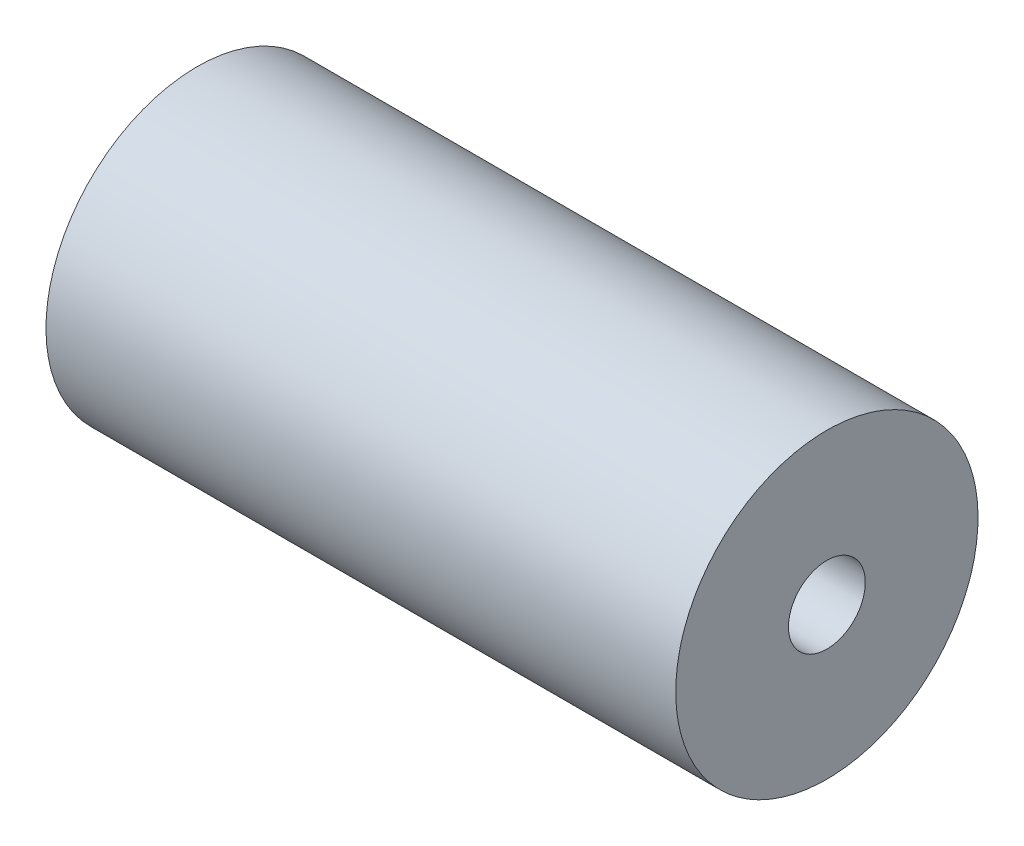
ISO-10303-21;
HEADER;
FILE_DESCRIPTION(('STEP AP214'),'2;1');
FILE_NAME('part.step','',(''),(''),'','','');
FILE_SCHEMA(('AUTOMOTIVE_DESIGN { 1 0 10303 214 1 1 1 1 }'));
ENDSEC;
DATA;
#1=APPLICATION_CONTEXT('core data for automotive mechanical design processes');
#2=APPLICATION_PROTOCOL_DEFINITION('international standard','automotive_design',2000,#1);
#3=PRODUCT_CONTEXT('',#1,'mechanical');
#4=PRODUCT('Part','Part','',(#3));
#5=PRODUCT_RELATED_PRODUCT_CATEGORY('part','',(#4));
#6=PRODUCT_DEFINITION_FORMATION('','',#4);
#7=PRODUCT_DEFINITION_CONTEXT('part definition',#1,'design');
#8=PRODUCT_DEFINITION('design','',#6,#7);
#9=PRODUCT_DEFINITION_SHAPE('','',#8);
#10=(LENGTH_UNIT() NAMED_UNIT(*) SI_UNIT(.MILLI.,.METRE.));
#11=(NAMED_UNIT(*) PLANE_ANGLE_UNIT() SI_UNIT($,.RADIAN.));
#12=(NAMED_UNIT(*) SI_UNIT($,.STERADIAN.) SOLID_ANGLE_UNIT());
#13=UNCERTAINTY_MEASURE_WITH_UNIT(LENGTH_MEASURE(1.E-05),#10,'distance_accuracy_value','');
#14=(GEOMETRIC_REPRESENTATION_CONTEXT(3) GLOBAL_UNCERTAINTY_ASSIGNED_CONTEXT((#13)) GLOBAL_UNIT_ASSIGNED_CONTEXT((#10,
#11,#12)) REPRESENTATION_CONTEXT('',''));
#15=CARTESIAN_POINT('',(0.,0.,0.));
#16=DIRECTION('',(0.,0.,1.));
#17=DIRECTION('',(1.,0.,0.));
#18=AXIS2_PLACEMENT_3D('',#15,#16,#17);
#19=CARTESIAN_POINT('',(19.85,0.,0.));
#20=DIRECTION('',(1.,0.,0.));
#21=DIRECTION('',(0.,0.,-1.));
#22=AXIS2_PLACEMENT_3D('',#19,#20,#21);
#23=PLANE('',#22);
#24=CARTESIAN_POINT('',(19.85,37.,-20.));
#25=DIRECTION('',(1.,0.,0.));
#26=DIRECTION('',(0.,0.,-1.));
#27=AXIS2_PLACEMENT_3D('',#24,#25,#26);
#28=CIRCLE('',#27,3.05);
#29=CARTESIAN_POINT('',(19.85,37.,-16.95));
#30=VERTEX_POINT('',#29);
#31=EDGE_CURVE('E50',#30,#30,#28,.T.);
#32=ORIENTED_EDGE('',*,*,#31,.T.);
#33=EDGE_LOOP('',(#32));
#34=FACE_BOUND('',#33,.T.);
#35=CARTESIAN_POINT('',(19.85,37.,-20.));
#36=DIRECTION('',(1.,0.,0.));
#37=DIRECTION('',(0.,0.,-1.));
#38=AXIS2_PLACEMENT_3D('',#35,#36,#37);
#39=CIRCLE('',#38,12.);
#40=CARTESIAN_POINT('',(19.85,34.3077496007728,-31.6946335111074));
#41=VERTEX_POINT('',#40);
#42=CARTESIAN_POINT('',(19.85,40.0508868410212,-31.6061800989185));
#43=VERTEX_POINT('',#42);
#44=EDGE_CURVE('E139',#41,#43,#39,.T.);
#45=ORIENTED_EDGE('',*,*,#44,.F.);
#46=CARTESIAN_POINT('',(19.85,33.9492351160142,-8.39427582515252));
#47=VERTEX_POINT('',#46);
#48=EDGE_CURVE('E11',#47,#41,#39,.T.);
#49=ORIENTED_EDGE('',*,*,#48,.F.);
#50=CARTESIAN_POINT('',(19.85,39.6922522203915,-8.30535885265193));
#51=VERTEX_POINT('',#50);
#52=EDGE_CURVE('E55',#51,#47,#39,.T.);
#53=ORIENTED_EDGE('',*,*,#52,.F.);
#54=EDGE_CURVE('E67',#43,#51,#39,.T.);
#55=ORIENTED_EDGE('',*,*,#54,.F.);
#56=EDGE_LOOP('',(#45,#49,#53,#55));
#57=FACE_BOUND('',#56,.T.);
#58=ADVANCED_FACE('F43',(#34,#57),#23,.F.);
#59=CARTESIAN_POINT('',(69.85,0.,0.));
#60=DIRECTION('',(1.,0.,0.));
#61=DIRECTION('',(0.,0.,-1.));
#62=AXIS2_PLACEMENT_3D('',#59,#60,#61);
#63=PLANE('',#62);
#64=CARTESIAN_POINT('',(69.85,34.3078691969763,-31.6941195367334));
#65=CARTESIAN_POINT('',(69.85,35.7281338553481,-32.021082009046));
#66=CARTESIAN_POINT('',(69.85,37.1846845409201,-31.9985733868676));
#67=CARTESIAN_POINT('',(69.85,38.6419571158423,-31.9760536090633));
#68=CARTESIAN_POINT('',(69.85,40.0507668572435,-31.6057236561427));
#69=B_SPLINE_CURVE_WITH_KNOTS('',2,(#64,#65,#66,#67,#68),.UNSPECIFIED.,.F.,.F.,(3,2,3),(0.,0.5,
1.),.UNSPECIFIED.);
#70=CARTESIAN_POINT('',(69.85,34.3077502051883,-31.6946336502513));
#71=VERTEX_POINT('',#70);
#72=CARTESIAN_POINT('',(69.85,40.0508868410988,-31.6061800988982));
#73=VERTEX_POINT('',#72);
#74=EDGE_CURVE('E86',#71,#73,#69,.T.);
#75=ORIENTED_EDGE('',*,*,#74,.T.);
#76=CARTESIAN_POINT('',(69.85,40.0507668570882,-31.6057236561833));
#77=CARTESIAN_POINT('',(69.85,41.9965304381791,-31.094245766413));
#78=CARTESIAN_POINT('',(69.85,43.6697084259949,-29.9757199996899));
#79=CARTESIAN_POINT('',(69.85,45.3419598558312,-28.8578136404548));
#80=CARTESIAN_POINT('',(69.85,46.5589815772571,-27.2543691114844));
#81=CARTESIAN_POINT('',(69.85,47.7750964278817,-25.6521193985138));
#82=CARTESIAN_POINT('',(69.85,48.4024988249203,-23.7393877236375));
#83=CARTESIAN_POINT('',(69.85,49.0294337094204,-21.828081331873));
#84=CARTESIAN_POINT('',(69.85,48.9985787419884,-19.8153160204432));
#85=CARTESIAN_POINT('',(69.85,48.9677467663147,-17.8040505327849));
#86=CARTESIAN_POINT('',(69.85,48.2820099785646,-15.911448808738));
#87=CARTESIAN_POINT('',(69.85,47.5967841715755,-14.0202573678881));
#88=CARTESIAN_POINT('',(69.85,46.3311854061728,-12.454870516974));
#89=CARTESIAN_POINT('',(69.85,45.0665297090657,-10.8906501231945));
#90=CARTESIAN_POINT('',(69.85,43.3595259103934,-9.82373201045515));
#91=CARTESIAN_POINT('',(69.85,41.6534670951792,-8.75740453492963));
#92=CARTESIAN_POINT('',(69.85,39.6921320718773,-8.3058807553724));
#93=B_SPLINE_CURVE_WITH_KNOTS('',2,(#76,#77,#78,#79,#80,#81,#82,#83,#84,#85,#86,#87,#88,#89,#90,
#91,#92),.UNSPECIFIED.,.F.,.F.,(3,2,2,2,2,2,2,2,3),(0.,0.125,0.25,0.375,0.5,0.625,0.75,0.875,
1.),.UNSPECIFIED.);
#94=CARTESIAN_POINT('',(69.85,39.6933788359378,-8.30561821347049));
#95=VERTEX_POINT('',#94);
#96=EDGE_CURVE('E93',#73,#95,#93,.T.);
#97=ORIENTED_EDGE('',*,*,#96,.T.);
#98=CARTESIAN_POINT('',(69.85,39.7011449962479,-8.30795564192084));
#99=CARTESIAN_POINT('',(69.85,38.2741366653843,-7.97944069287993));
#100=CARTESIAN_POINT('',(69.85,36.8199074354538,-8.00135681130258));
#101=CARTESIAN_POINT('',(69.85,35.3602963136463,-8.0233540381071));
#102=CARTESIAN_POINT('',(69.85,33.9492351160142,-8.39427582515252));
#103=B_SPLINE_CURVE_WITH_KNOTS('',2,(#98,#99,#100,#101,#102),.UNSPECIFIED.,.F.,.F.,(3,2,3),(0.,
0.5,1.),.UNSPECIFIED.);
#104=CARTESIAN_POINT('',(69.85,33.9492351160142,-8.39427582515252));
#105=VERTEX_POINT('',#104);
#106=EDGE_CURVE('E105',#95,#105,#103,.T.);
#107=ORIENTED_EDGE('',*,*,#106,.T.);
#108=CARTESIAN_POINT('',(69.85,33.9492351160142,-8.39427582515252));
#109=CARTESIAN_POINT('',(69.85,31.973609140095,-8.91360320709105));
#110=CARTESIAN_POINT('',(69.85,30.2872348548457,-10.0524870837647));
#111=CARTESIAN_POINT('',(69.85,28.6443485428794,-11.1620015896917));
#112=CARTESIAN_POINT('',(69.85,27.4417349333656,-12.7463627767191));
#113=CARTESIAN_POINT('',(69.85,26.2411698358849,-14.3280251892353));
#114=CARTESIAN_POINT('',(69.85,25.6130380150679,-16.2122112936242));
#115=CARTESIAN_POINT('',(69.85,24.9698459575159,-18.1415730885999));
#116=CARTESIAN_POINT('',(69.85,25.0014212523319,-20.1846836105549));
#117=CARTESIAN_POINT('',(69.85,25.033019073089,-22.2292516956973));
#118=CARTESIAN_POINT('',(69.85,25.7350088847172,-24.1364503747823));
#119=CARTESIAN_POINT('',(69.85,26.4215443087034,-26.0016618523317));
#120=CARTESIAN_POINT('',(69.85,27.6695077756488,-27.5443753155798));
#121=CARTESIAN_POINT('',(69.85,28.9213910722107,-29.091934412601));
#122=CARTESIAN_POINT('',(69.85,30.5965690133043,-30.149399032026));
#123=CARTESIAN_POINT('',(69.85,32.3179150702453,-31.2360075100564));
#124=CARTESIAN_POINT('',(69.85,34.3078691969763,-31.6941195367334));
#125=B_SPLINE_CURVE_WITH_KNOTS('',2,(#108,#109,#110,#111,#112,#113,#114,#115,#116,#117,#118,
#119,#120,#121,#122,#123,#124),.UNSPECIFIED.,.F.,.F.,(3,2,2,2,2,2,2,2,3),(0.,0.125,0.25,0.375,
0.5,0.625,0.75,0.875,1.),.UNSPECIFIED.);
#126=EDGE_CURVE('E91',#105,#71,#125,.T.);
#127=ORIENTED_EDGE('',*,*,#126,.T.);
#128=EDGE_LOOP('',(#75,#97,#107,#127));
#129=FACE_BOUND('',#128,.T.);
#130=CARTESIAN_POINT('',(69.85,37.,-20.));
#131=DIRECTION('',(1.,0.,0.));
#132=DIRECTION('',(0.,0.,-1.));
#133=AXIS2_PLACEMENT_3D('',#130,#131,#132);
#134=CIRCLE('',#133,3.05);
#135=CARTESIAN_POINT('',(69.85,37.,-16.95));
#136=VERTEX_POINT('',#135);
#137=EDGE_CURVE('E127',#136,#136,#134,.T.);
#138=ORIENTED_EDGE('',*,*,#137,.F.);
#139=EDGE_LOOP('',(#138));
#140=FACE_BOUND('',#139,.T.);
#141=ADVANCED_FACE('F99',(#129,#140),#63,.T.);
#142=CARTESIAN_POINT('',(78.7911254969543,37.,-20.));
#143=DIRECTION('',(-1.,0.,0.));
#144=DIRECTION('',(0.,0.,1.));
#145=AXIS2_PLACEMENT_3D('',#142,#143,#144);
#146=CYLINDRICAL_SURFACE('',#145,12.);
#147=ORIENTED_EDGE('',*,*,#54,.T.);
#148=ORIENTED_EDGE('',*,*,#52,.T.);
#149=ORIENTED_EDGE('',*,*,#48,.T.);
#150=ORIENTED_EDGE('',*,*,#44,.T.);
#151=EDGE_LOOP('',(#147,#148,#149,#150));
#152=FACE_BOUND('',#151,.T.);
#153=ORIENTED_EDGE('',*,*,#96,.F.);
#154=ORIENTED_EDGE('',*,*,#74,.F.);
#155=ORIENTED_EDGE('',*,*,#126,.F.);
#156=ORIENTED_EDGE('',*,*,#106,.F.);
#157=EDGE_LOOP('',(#153,#154,#155,#156));
#158=FACE_BOUND('',#157,.T.);
#159=ADVANCED_FACE('F87',(#152,#158),#146,.T.);
#160=CARTESIAN_POINT('',(94.7913817240438,37.,-20.));
#161=DIRECTION('',(-1.,0.,0.));
#162=DIRECTION('',(0.,0.,1.));
#163=AXIS2_PLACEMENT_3D('',#160,#161,#162);
#164=CYLINDRICAL_SURFACE('',#163,3.05);
#165=CARTESIAN_POINT('',(19.85,37.,-16.95));
#166=CARTESIAN_POINT('',(20.3708333333333,37.,-16.95));
#167=CARTESIAN_POINT('',(20.8916666666667,37.,-16.95));
#168=CARTESIAN_POINT('',(21.9333333333333,37.,-16.95));
#169=CARTESIAN_POINT('',(22.4541666666667,37.,-16.95));
#170=CARTESIAN_POINT('',(23.4958333333333,37.,-16.95));
#171=CARTESIAN_POINT('',(24.0166666666667,37.,-16.95));
#172=CARTESIAN_POINT('',(25.0583333333333,37.,-16.95));
#173=CARTESIAN_POINT('',(25.5791666666667,37.,-16.95));
#174=CARTESIAN_POINT('',(26.6208333333333,37.,-16.95));
#175=CARTESIAN_POINT('',(27.1416666666667,37.,-16.95));
#176=CARTESIAN_POINT('',(28.1833333333333,37.,-16.95));
#177=CARTESIAN_POINT('',(28.7041666666667,37.,-16.95));
#178=CARTESIAN_POINT('',(29.7458333333333,37.,-16.95));
#179=CARTESIAN_POINT('',(30.2666666666667,37.,-16.95));
#180=CARTESIAN_POINT('',(31.3083333333333,37.,-16.95));
#181=CARTESIAN_POINT('',(31.8291666666667,37.,-16.95));
#182=CARTESIAN_POINT('',(32.8708333333333,37.,-16.95));
#183=CARTESIAN_POINT('',(33.3916666666667,37.,-16.95));
#184=CARTESIAN_POINT('',(34.4333333333333,37.,-16.95));
#185=CARTESIAN_POINT('',(34.9541666666667,37.,-16.95));
#186=CARTESIAN_POINT('',(35.9958333333333,37.,-16.95));
#187=CARTESIAN_POINT('',(36.5166666666667,37.,-16.95));
#188=CARTESIAN_POINT('',(37.5583333333333,37.,-16.95));
#189=CARTESIAN_POINT('',(38.0791666666667,37.,-16.95));
#190=CARTESIAN_POINT('',(39.1208333333333,37.,-16.95));
#191=CARTESIAN_POINT('',(39.6416666666667,37.,-16.95));
#192=CARTESIAN_POINT('',(40.6833333333333,37.,-16.95));
#193=CARTESIAN_POINT('',(41.2041666666667,37.,-16.95));
#194=CARTESIAN_POINT('',(42.2458333333333,37.,-16.95));
#195=CARTESIAN_POINT('',(42.7666666666667,37.,-16.95));
#196=CARTESIAN_POINT('',(43.8083333333333,37.,-16.95));
#197=CARTESIAN_POINT('',(44.3291666666667,37.,-16.95));
#198=CARTESIAN_POINT('',(45.3708333333333,37.,-16.95));
#199=CARTESIAN_POINT('',(45.8916666666667,37.,-16.95));
#200=CARTESIAN_POINT('',(46.9333333333333,37.,-16.95));
#201=CARTESIAN_POINT('',(47.4541666666667,37.,-16.95));
#202=CARTESIAN_POINT('',(48.4958333333333,37.,-16.95));
#203=CARTESIAN_POINT('',(49.0166666666667,37.,-16.95));
#204=CARTESIAN_POINT('',(50.0583333333333,37.,-16.95));
#205=CARTESIAN_POINT('',(50.5791666666667,37.,-16.95));
#206=CARTESIAN_POINT('',(51.6208333333333,37.,-16.95));
#207=CARTESIAN_POINT('',(52.1416666666667,37.,-16.95));
#208=CARTESIAN_POINT('',(53.1833333333333,37.,-16.95));
#209=CARTESIAN_POINT('',(53.7041666666667,37.,-16.95));
#210=CARTESIAN_POINT('',(54.7458333333333,37.,-16.95));
#211=CARTESIAN_POINT('',(55.2666666666667,37.,-16.95));
#212=CARTESIAN_POINT('',(56.3083333333333,37.,-16.95));
#213=CARTESIAN_POINT('',(56.8291666666667,37.,-16.95));
#214=CARTESIAN_POINT('',(57.8708333333333,37.,-16.95));
#215=CARTESIAN_POINT('',(58.3916666666667,37.,-16.95));
#216=CARTESIAN_POINT('',(59.4333333333333,37.,-16.95));
#217=CARTESIAN_POINT('',(59.9541666666667,37.,-16.95));
#218=CARTESIAN_POINT('',(60.9958333333333,37.,-16.95));
#219=CARTESIAN_POINT('',(61.5166666666667,37.,-16.95));
#220=CARTESIAN_POINT('',(62.5583333333333,37.,-16.95));
#221=CARTESIAN_POINT('',(63.0791666666667,37.,-16.95));
#222=CARTESIAN_POINT('',(64.1208333333333,37.,-16.95));
#223=CARTESIAN_POINT('',(64.6416666666667,37.,-16.95));
#224=CARTESIAN_POINT('',(65.6833333333333,37.,-16.95));
#225=CARTESIAN_POINT('',(66.2041666666667,37.,-16.95));
#226=CARTESIAN_POINT('',(67.2458333333333,37.,-16.95));
#227=CARTESIAN_POINT('',(67.7666666666667,37.,-16.95));
#228=CARTESIAN_POINT('',(68.8083333333333,37.,-16.95));
#229=CARTESIAN_POINT('',(69.3291666666667,37.,-16.95));
#230=CARTESIAN_POINT('',(69.85,37.,-16.95));
#231=B_SPLINE_CURVE_WITH_KNOTS('',3,(#165,#166,#167,#168,#169,#170,#171,#172,#173,#174,#175,
#176,#177,#178,#179,#180,#181,#182,#183,#184,#185,#186,#187,#188,#189,#190,#191,#192,#193,#194,
#195,#196,#197,#198,#199,#200,#201,#202,#203,#204,#205,#206,#207,#208,#209,#210,#211,#212,#213,
#214,#215,#216,#217,#218,#219,#220,#221,#222,#223,#224,#225,#226,#227,#228,#229,#230),
.UNSPECIFIED.,.F.,.F.,(4,2,2,2,2,2,2,2,2,2,2,2,2,2,2,2,2,2,2,2,2,2,2,2,2,2,2,2,2,2,2,2,4),(0.,
1.56249999999999,3.125,4.6875,6.25000000000001,7.8125,9.37499999999999,10.9375,12.5,14.0625,
15.625,17.1875,18.75,20.3125,21.875,23.4375,25.,26.5625,28.125,29.6875,31.25,32.8125,34.375,
35.9375,37.5,39.0625,40.625,42.1875,43.75,45.3125,46.875,48.4375,50.),.UNSPECIFIED.);
#232=EDGE_CURVE('BSEAM44',#30,#136,#231,.T.);
#233=ORIENTED_EDGE('',*,*,#31,.F.);
#234=ORIENTED_EDGE('',*,*,#137,.T.);
#235=ORIENTED_EDGE('',*,*,#232,.T.);
#236=ORIENTED_EDGE('',*,*,#232,.F.);
#237=EDGE_LOOP('',(#233,#235,#234,#236));
#238=FACE_BOUND('',#237,.T.);
#239=ADVANCED_FACE('F44',(#238),#164,.F.);
#240=CLOSED_SHELL('',(#58,#141,#159,#239));
#241=MANIFOLD_SOLID_BREP('B2',#240);
#242=ADVANCED_BREP_SHAPE_REPRESENTATION('',(#18,#241),#14);
#243=SHAPE_DEFINITION_REPRESENTATION(#9,#242);
ENDSEC;
END-ISO-10303-21;
